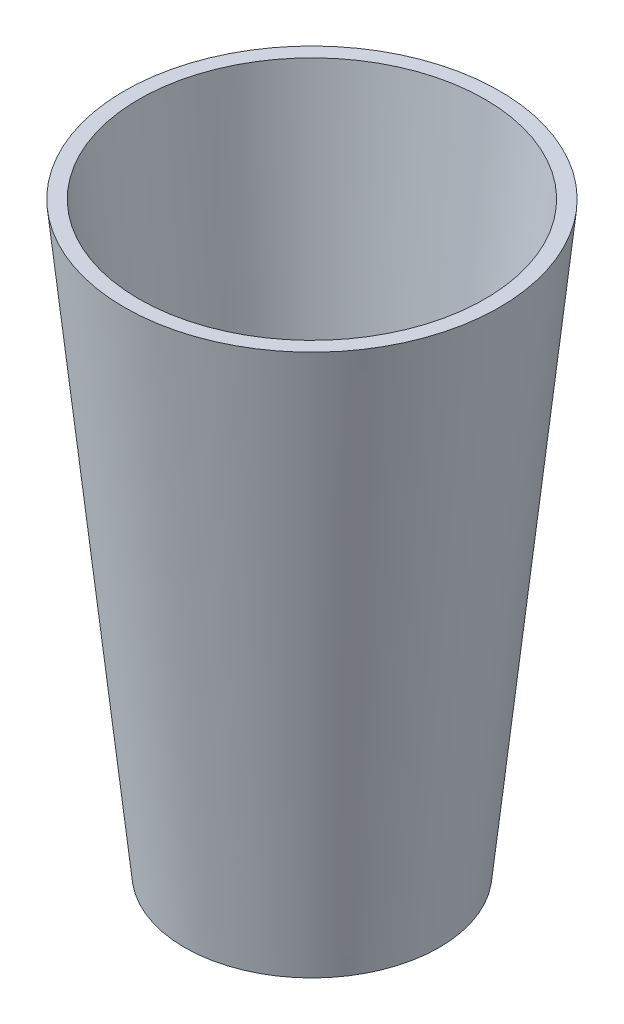
ISO-10303-21;
HEADER;
FILE_DESCRIPTION(('STEP AP214'),'2;1');
FILE_NAME('part.step','',(''),(''),'','','');
FILE_SCHEMA(('AUTOMOTIVE_DESIGN { 1 0 10303 214 1 1 1 1 }'));
ENDSEC;
DATA;
#1=APPLICATION_CONTEXT('core data for automotive mechanical design processes');
#2=APPLICATION_PROTOCOL_DEFINITION('international standard','automotive_design',2000,#1);
#3=PRODUCT_CONTEXT('',#1,'mechanical');
#4=PRODUCT('Part','Part','',(#3));
#5=PRODUCT_RELATED_PRODUCT_CATEGORY('part','',(#4));
#6=PRODUCT_DEFINITION_FORMATION('','',#4);
#7=PRODUCT_DEFINITION_CONTEXT('part definition',#1,'design');
#8=PRODUCT_DEFINITION('design','',#6,#7);
#9=PRODUCT_DEFINITION_SHAPE('','',#8);
#10=(LENGTH_UNIT() NAMED_UNIT(*) SI_UNIT(.MILLI.,.METRE.));
#11=(NAMED_UNIT(*) PLANE_ANGLE_UNIT() SI_UNIT($,.RADIAN.));
#12=(NAMED_UNIT(*) SI_UNIT($,.STERADIAN.) SOLID_ANGLE_UNIT());
#13=UNCERTAINTY_MEASURE_WITH_UNIT(LENGTH_MEASURE(1.E-05),#10,'distance_accuracy_value','');
#14=(GEOMETRIC_REPRESENTATION_CONTEXT(3) GLOBAL_UNCERTAINTY_ASSIGNED_CONTEXT((#13)) GLOBAL_UNIT_ASSIGNED_CONTEXT((#10,
#11,#12)) REPRESENTATION_CONTEXT('',''));
#15=CARTESIAN_POINT('',(0.,0.,0.));
#16=DIRECTION('',(0.,0.,1.));
#17=DIRECTION('',(1.,0.,0.));
#18=AXIS2_PLACEMENT_3D('',#15,#16,#17);
#19=CARTESIAN_POINT('',(0.,-41.8029988465975,0.));
#20=DIRECTION('',(0.,1.,0.));
#21=DIRECTION('',(0.,0.,1.));
#22=AXIS2_PLACEMENT_3D('',#19,#20,#21);
#23=PLANE('',#22);
#24=CARTESIAN_POINT('',(0.,-41.8029988465975,0.));
#25=DIRECTION('',(0.,1.,0.));
#26=DIRECTION('',(0.,0.,1.));
#27=AXIS2_PLACEMENT_3D('',#24,#25,#26);
#28=CIRCLE('',#27,17.6311967924425);
#29=CARTESIAN_POINT('',(0.,-41.8029988465975,17.6311967924425));
#30=VERTEX_POINT('',#29);
#31=EDGE_CURVE('E10',#30,#30,#28,.T.);
#32=ORIENTED_EDGE('',*,*,#31,.F.);
#33=EDGE_LOOP('',(#32));
#34=FACE_BOUND('',#33,.T.);
#35=ADVANCED_FACE('F37',(#34),#23,.F.);
#36=CARTESIAN_POINT('',(0.,-41.8029988465975,0.));
#37=DIRECTION('',(0.,1.,0.));
#38=DIRECTION('',(0.,0.,1.));
#39=AXIS2_PLACEMENT_3D('',#36,#37,#38);
#40=CONICAL_SURFACE('',#39,17.6311967924425,0.102682087968647);
#41=CARTESIAN_POINT('',(0.,39.1488401896706,0.));
#42=DIRECTION('',(0.,1.,0.));
#43=DIRECTION('',(0.,0.,1.));
#44=AXIS2_PLACEMENT_3D('',#41,#42,#43);
#45=CIRCLE('',#44,25.972838285641);
#46=CARTESIAN_POINT('',(0.,39.1488401896706,25.972838285641));
#47=VERTEX_POINT('',#46);
#48=EDGE_CURVE('E44',#47,#47,#45,.T.);
#49=ORIENTED_EDGE('',*,*,#48,.F.);
#50=EDGE_LOOP('',(#49));
#51=FACE_BOUND('',#50,.T.);
#52=ORIENTED_EDGE('',*,*,#31,.T.);
#53=EDGE_LOOP('',(#52));
#54=FACE_BOUND('',#53,.T.);
#55=ADVANCED_FACE('F67',(#51,#54),#40,.T.);
#56=CARTESIAN_POINT('',(25.972838285641,39.1488401896706,0.));
#57=DIRECTION('',(0.,-1.,0.));
#58=DIRECTION('',(0.,0.,-1.));
#59=AXIS2_PLACEMENT_3D('',#56,#57,#58);
#60=PLANE('',#59);
#61=CARTESIAN_POINT('',(0.,39.1488401896706,0.));
#62=DIRECTION('',(0.,-1.,0.));
#63=DIRECTION('',(0.,0.,-1.));
#64=AXIS2_PLACEMENT_3D('',#61,#62,#63);
#65=CIRCLE('',#64,23.962248155101);
#66=CARTESIAN_POINT('',(0.,39.1488401896706,-23.962248155101));
#67=VERTEX_POINT('',#66);
#68=EDGE_CURVE('E54',#67,#67,#65,.F.);
#69=ORIENTED_EDGE('',*,*,#68,.F.);
#70=EDGE_LOOP('',(#69));
#71=FACE_BOUND('',#70,.T.);
#72=ORIENTED_EDGE('',*,*,#48,.T.);
#73=EDGE_LOOP('',(#72));
#74=FACE_BOUND('',#73,.T.);
#75=ADVANCED_FACE('F64',(#71,#74),#60,.F.);
#76=CARTESIAN_POINT('',(0.,-39.8029988465975,0.));
#77=DIRECTION('',(0.,1.,0.));
#78=DIRECTION('',(0.,0.,1.));
#79=AXIS2_PLACEMENT_3D('',#76,#77,#78);
#80=PLANE('',#79);
#81=CARTESIAN_POINT('',(0.,-39.8029988465975,0.));
#82=DIRECTION('',(0.,1.,0.));
#83=DIRECTION('',(0.,0.,1.));
#84=AXIS2_PLACEMENT_3D('',#81,#82,#83);
#85=CIRCLE('',#84,15.8266956548766);
#86=CARTESIAN_POINT('',(0.,-39.8029988465975,15.8266956548766));
#87=VERTEX_POINT('',#86);
#88=EDGE_CURVE('E49',#87,#87,#85,.T.);
#89=ORIENTED_EDGE('',*,*,#88,.T.);
#90=EDGE_LOOP('',(#89));
#91=FACE_BOUND('',#90,.T.);
#92=ADVANCED_FACE('F66',(#91),#80,.T.);
#93=CARTESIAN_POINT('',(0.,-41.5979953604629,0.));
#94=DIRECTION('',(0.,1.,0.));
#95=DIRECTION('',(0.,0.,1.));
#96=AXIS2_PLACEMENT_3D('',#93,#94,#95);
#97=CONICAL_SURFACE('',#96,15.6417311429092,0.102682087968647);
#98=ORIENTED_EDGE('',*,*,#68,.T.);
#99=EDGE_LOOP('',(#98));
#100=FACE_BOUND('',#99,.T.);
#101=ORIENTED_EDGE('',*,*,#88,.F.);
#102=EDGE_LOOP('',(#101));
#103=FACE_BOUND('',#102,.T.);
#104=ADVANCED_FACE('F61',(#100,#103),#97,.F.);
#105=CLOSED_SHELL('',(#35,#55,#75,#92,#104));
#106=MANIFOLD_SOLID_BREP('B2',#105);
#107=ADVANCED_BREP_SHAPE_REPRESENTATION('',(#18,#106),#14);
#108=SHAPE_DEFINITION_REPRESENTATION(#9,#107);
ENDSEC;
END-ISO-10303-21;
